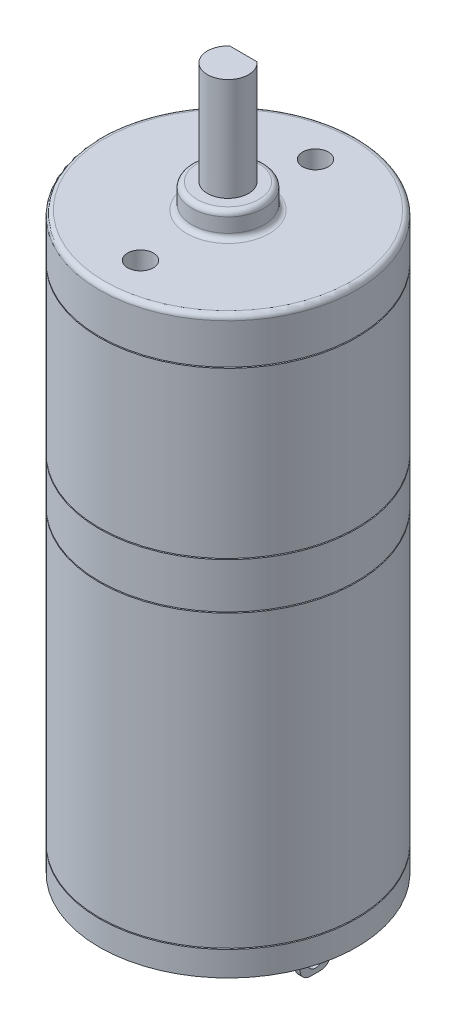
ISO-10303-21;
HEADER;
FILE_DESCRIPTION(('STEP AP214'),'2;1');
FILE_NAME('part.step','',(''),(''),'','','');
FILE_SCHEMA(('AUTOMOTIVE_DESIGN { 1 0 10303 214 1 1 1 1 }'));
ENDSEC;
DATA;
#1=APPLICATION_CONTEXT('core data for automotive mechanical design processes');
#2=APPLICATION_PROTOCOL_DEFINITION('international standard','automotive_design',2000,#1);
#3=PRODUCT_CONTEXT('',#1,'mechanical');
#4=PRODUCT('Part','Part','',(#3));
#5=PRODUCT_RELATED_PRODUCT_CATEGORY('part','',(#4));
#6=PRODUCT_DEFINITION_FORMATION('','',#4);
#7=PRODUCT_DEFINITION_CONTEXT('part definition',#1,'design');
#8=PRODUCT_DEFINITION('design','',#6,#7);
#9=PRODUCT_DEFINITION_SHAPE('','',#8);
#10=(LENGTH_UNIT() NAMED_UNIT(*) SI_UNIT(.MILLI.,.METRE.));
#11=(NAMED_UNIT(*) PLANE_ANGLE_UNIT() SI_UNIT($,.RADIAN.));
#12=(NAMED_UNIT(*) SI_UNIT($,.STERADIAN.) SOLID_ANGLE_UNIT());
#13=UNCERTAINTY_MEASURE_WITH_UNIT(LENGTH_MEASURE(1.E-05),#10,'distance_accuracy_value','');
#14=(GEOMETRIC_REPRESENTATION_CONTEXT(3) GLOBAL_UNCERTAINTY_ASSIGNED_CONTEXT((#13)) GLOBAL_UNIT_ASSIGNED_CONTEXT((#10,
#11,#12)) REPRESENTATION_CONTEXT('',''));
#15=CARTESIAN_POINT('',(0.,0.,0.));
#16=DIRECTION('',(0.,0.,1.));
#17=DIRECTION('',(1.,0.,0.));
#18=AXIS2_PLACEMENT_3D('',#15,#16,#17);
#19=CARTESIAN_POINT('',(0.,-50.6,0.));
#20=DIRECTION('',(0.,-1.,0.));
#21=DIRECTION('',(0.,0.,-1.));
#22=AXIS2_PLACEMENT_3D('',#19,#20,#21);
#23=PLANE('',#22);
#24=CARTESIAN_POINT('',(0.,-50.6,0.));
#25=DIRECTION('',(0.,-1.,0.));
#26=DIRECTION('',(0.,0.,-1.));
#27=AXIS2_PLACEMENT_3D('',#24,#25,#26);
#28=CIRCLE('',#27,11.5);
#29=CARTESIAN_POINT('',(0.,-50.6,-11.5));
#30=VERTEX_POINT('',#29);
#31=EDGE_CURVE('E243',#30,#30,#28,.T.);
#32=ORIENTED_EDGE('',*,*,#31,.T.);
#33=EDGE_LOOP('',(#32));
#34=FACE_BOUND('',#33,.T.);
#35=DIRECTION('',(0.,0.,-1.));
#36=VECTOR('',#35,1.);
#37=CARTESIAN_POINT('',(-8.5,-50.6,1.5));
#38=LINE('',#37,#36);
#39=CARTESIAN_POINT('',(-8.5,-50.6,1.5));
#40=VERTEX_POINT('',#39);
#41=CARTESIAN_POINT('',(-8.5,-50.6,-1.5));
#42=VERTEX_POINT('',#41);
#43=EDGE_CURVE('E227',#40,#42,#38,.T.);
#44=ORIENTED_EDGE('',*,*,#43,.F.);
#45=DIRECTION('',(-1.,0.,0.));
#46=VECTOR('',#45,1.);
#47=CARTESIAN_POINT('',(-8.,-50.6,1.5));
#48=LINE('',#47,#46);
#49=CARTESIAN_POINT('',(-8.,-50.6,1.5));
#50=VERTEX_POINT('',#49);
#51=EDGE_CURVE('E216',#50,#40,#48,.T.);
#52=ORIENTED_EDGE('',*,*,#51,.F.);
#53=DIRECTION('',(0.,0.,1.));
#54=VECTOR('',#53,1.);
#55=CARTESIAN_POINT('',(-8.,-50.6,-1.5));
#56=LINE('',#55,#54);
#57=CARTESIAN_POINT('',(-8.,-50.6,-1.5));
#58=VERTEX_POINT('',#57);
#59=EDGE_CURVE('E221',#58,#50,#56,.T.);
#60=ORIENTED_EDGE('',*,*,#59,.F.);
#61=DIRECTION('',(1.,0.,0.));
#62=VECTOR('',#61,1.);
#63=CARTESIAN_POINT('',(-8.5,-50.6,-1.5));
#64=LINE('',#63,#62);
#65=EDGE_CURVE('E230',#42,#58,#64,.T.);
#66=ORIENTED_EDGE('',*,*,#65,.F.);
#67=EDGE_LOOP('',(#44,#52,#60,#66));
#68=FACE_BOUND('',#67,.T.);
#69=DIRECTION('',(0.,0.,1.));
#70=VECTOR('',#69,1.);
#71=CARTESIAN_POINT('',(8.5,-50.6,1.50000000000001));
#72=LINE('',#71,#70);
#73=CARTESIAN_POINT('',(8.5,-50.6,-1.49999999999999));
#74=VERTEX_POINT('',#73);
#75=CARTESIAN_POINT('',(8.5,-50.6,1.50000000000001));
#76=VERTEX_POINT('',#75);
#77=EDGE_CURVE('E201',#74,#76,#72,.T.);
#78=ORIENTED_EDGE('',*,*,#77,.F.);
#79=DIRECTION('',(1.,0.,0.));
#80=VECTOR('',#79,1.);
#81=CARTESIAN_POINT('',(8.5,-50.6,-1.49999999999999));
#82=LINE('',#81,#80);
#83=CARTESIAN_POINT('',(8.,-50.6,-1.49999999999999));
#84=VERTEX_POINT('',#83);
#85=EDGE_CURVE('E190',#84,#74,#82,.T.);
#86=ORIENTED_EDGE('',*,*,#85,.F.);
#87=DIRECTION('',(0.,0.,-1.));
#88=VECTOR('',#87,1.);
#89=CARTESIAN_POINT('',(8.,-50.6,-1.49999999999999));
#90=LINE('',#89,#88);
#91=CARTESIAN_POINT('',(8.,-50.6,1.50000000000001));
#92=VERTEX_POINT('',#91);
#93=EDGE_CURVE('E195',#92,#84,#90,.T.);
#94=ORIENTED_EDGE('',*,*,#93,.F.);
#95=DIRECTION('',(-1.,0.,0.));
#96=VECTOR('',#95,1.);
#97=CARTESIAN_POINT('',(8.,-50.6,1.50000000000001));
#98=LINE('',#97,#96);
#99=EDGE_CURVE('E204',#76,#92,#98,.T.);
#100=ORIENTED_EDGE('',*,*,#99,.F.);
#101=EDGE_LOOP('',(#78,#86,#94,#100));
#102=FACE_BOUND('',#101,.T.);
#103=ADVANCED_FACE('F41',(#34,#68,#102),#23,.T.);
#104=CARTESIAN_POINT('',(0.,4.4,0.));
#105=DIRECTION('',(0.,-1.,0.));
#106=DIRECTION('',(0.,0.,-1.));
#107=AXIS2_PLACEMENT_3D('',#104,#105,#106);
#108=CYLINDRICAL_SURFACE('',#107,12.5);
#109=CARTESIAN_POINT('',(0.,3.9,0.));
#110=DIRECTION('',(0.,1.,0.));
#111=DIRECTION('',(0.,0.,1.));
#112=AXIS2_PLACEMENT_3D('',#109,#110,#111);
#113=CIRCLE('',#112,12.5);
#114=CARTESIAN_POINT('',(0.,3.9,12.5));
#115=VERTEX_POINT('',#114);
#116=EDGE_CURVE('E11',#115,#115,#113,.F.);
#117=ORIENTED_EDGE('',*,*,#116,.T.);
#118=EDGE_LOOP('',(#117));
#119=FACE_BOUND('',#118,.T.);
#120=CARTESIAN_POINT('',(0.,0.,0.));
#121=DIRECTION('',(0.,1.,0.));
#122=DIRECTION('',(0.,0.,1.));
#123=AXIS2_PLACEMENT_3D('',#120,#121,#122);
#124=CIRCLE('',#123,12.5);
#125=CARTESIAN_POINT('',(0.,0.,12.5));
#126=VERTEX_POINT('',#125);
#127=EDGE_CURVE('E295',#126,#126,#124,.T.);
#128=ORIENTED_EDGE('',*,*,#127,.T.);
#129=EDGE_LOOP('',(#128));
#130=FACE_BOUND('',#129,.T.);
#131=ADVANCED_FACE('F364',(#119,#130),#108,.T.);
#132=CARTESIAN_POINT('',(0.,4.4,0.));
#133=DIRECTION('',(0.,1.,0.));
#134=DIRECTION('',(0.,0.,1.));
#135=AXIS2_PLACEMENT_3D('',#132,#133,#134);
#136=PLANE('',#135);
#137=CARTESIAN_POINT('',(0.,4.4,0.));
#138=DIRECTION('',(0.,1.,0.));
#139=DIRECTION('',(0.,0.,1.));
#140=AXIS2_PLACEMENT_3D('',#137,#138,#139);
#141=CIRCLE('',#140,4.);
#142=CARTESIAN_POINT('',(0.,4.4,4.));
#143=VERTEX_POINT('',#142);
#144=EDGE_CURVE('E343',#143,#143,#141,.F.);
#145=ORIENTED_EDGE('',*,*,#144,.T.);
#146=EDGE_LOOP('',(#145));
#147=FACE_BOUND('',#146,.T.);
#148=CARTESIAN_POINT('',(0.,4.4,0.));
#149=DIRECTION('',(0.,1.,0.));
#150=DIRECTION('',(0.,0.,1.));
#151=AXIS2_PLACEMENT_3D('',#148,#149,#150);
#152=CIRCLE('',#151,12.);
#153=CARTESIAN_POINT('',(0.,4.4,12.));
#154=VERTEX_POINT('',#153);
#155=EDGE_CURVE('E340',#154,#154,#152,.T.);
#156=ORIENTED_EDGE('',*,*,#155,.T.);
#157=EDGE_LOOP('',(#156));
#158=FACE_BOUND('',#157,.T.);
#159=CARTESIAN_POINT('',(0.,4.4,-8.5));
#160=DIRECTION('',(0.,1.,0.));
#161=DIRECTION('',(0.,0.,1.));
#162=AXIS2_PLACEMENT_3D('',#159,#160,#161);
#163=CIRCLE('',#162,1.25);
#164=CARTESIAN_POINT('',(0.,4.4,-7.25));
#165=VERTEX_POINT('',#164);
#166=EDGE_CURVE('E173',#165,#165,#163,.T.);
#167=ORIENTED_EDGE('',*,*,#166,.F.);
#168=EDGE_LOOP('',(#167));
#169=FACE_BOUND('',#168,.T.);
#170=CARTESIAN_POINT('',(0.,4.4,8.5));
#171=DIRECTION('',(0.,1.,0.));
#172=DIRECTION('',(0.,0.,-1.));
#173=AXIS2_PLACEMENT_3D('',#170,#171,#172);
#174=CIRCLE('',#173,1.25);
#175=CARTESIAN_POINT('',(0.,4.4,7.25));
#176=VERTEX_POINT('',#175);
#177=EDGE_CURVE('E163',#176,#176,#174,.T.);
#178=ORIENTED_EDGE('',*,*,#177,.F.);
#179=EDGE_LOOP('',(#178));
#180=FACE_BOUND('',#179,.T.);
#181=ADVANCED_FACE('F370',(#147,#158,#169,#180),#136,.T.);
#182=CARTESIAN_POINT('',(0.,0.,0.));
#183=DIRECTION('',(0.,1.,0.));
#184=DIRECTION('',(0.,0.,1.));
#185=AXIS2_PLACEMENT_3D('',#182,#183,#184);
#186=PLANE('',#185);
#187=CARTESIAN_POINT('',(0.,0.,0.));
#188=DIRECTION('',(0.,-1.,0.));
#189=DIRECTION('',(0.,0.,-1.));
#190=AXIS2_PLACEMENT_3D('',#187,#188,#189);
#191=CIRCLE('',#190,12.15);
#192=CARTESIAN_POINT('',(0.,0.,-12.15));
#193=VERTEX_POINT('',#192);
#194=EDGE_CURVE('E286',#193,#193,#191,.T.);
#195=ORIENTED_EDGE('',*,*,#194,.F.);
#196=EDGE_LOOP('',(#195));
#197=FACE_BOUND('',#196,.T.);
#198=ORIENTED_EDGE('',*,*,#127,.F.);
#199=EDGE_LOOP('',(#198));
#200=FACE_BOUND('',#199,.T.);
#201=ADVANCED_FACE('F445',(#197,#200),#186,.F.);
#202=CARTESIAN_POINT('',(0.,-0.1,0.));
#203=DIRECTION('',(0.,1.,0.));
#204=DIRECTION('',(0.,0.,1.));
#205=AXIS2_PLACEMENT_3D('',#202,#203,#204);
#206=CYLINDRICAL_SURFACE('',#205,12.15);
#207=CARTESIAN_POINT('',(0.,-0.1,0.));
#208=DIRECTION('',(0.,-1.,0.));
#209=DIRECTION('',(0.,0.,-1.));
#210=AXIS2_PLACEMENT_3D('',#207,#208,#209);
#211=CIRCLE('',#210,12.15);
#212=CARTESIAN_POINT('',(0.,-0.1,-12.15));
#213=VERTEX_POINT('',#212);
#214=EDGE_CURVE('E290',#213,#213,#211,.T.);
#215=ORIENTED_EDGE('',*,*,#214,.F.);
#216=EDGE_LOOP('',(#215));
#217=FACE_BOUND('',#216,.T.);
#218=ORIENTED_EDGE('',*,*,#194,.T.);
#219=EDGE_LOOP('',(#218));
#220=FACE_BOUND('',#219,.T.);
#221=ADVANCED_FACE('F441',(#217,#220),#206,.T.);
#222=CARTESIAN_POINT('',(0.,-16.1,0.));
#223=DIRECTION('',(0.,1.,0.));
#224=DIRECTION('',(0.,0.,1.));
#225=AXIS2_PLACEMENT_3D('',#222,#223,#224);
#226=CYLINDRICAL_SURFACE('',#225,12.5);
#227=CARTESIAN_POINT('',(0.,-16.1,0.));
#228=DIRECTION('',(0.,-1.,0.));
#229=DIRECTION('',(0.,0.,-1.));
#230=AXIS2_PLACEMENT_3D('',#227,#228,#229);
#231=CIRCLE('',#230,12.5);
#232=CARTESIAN_POINT('',(0.,-16.1,-12.5));
#233=VERTEX_POINT('',#232);
#234=EDGE_CURVE('E287',#233,#233,#231,.T.);
#235=ORIENTED_EDGE('',*,*,#234,.F.);
#236=EDGE_LOOP('',(#235));
#237=FACE_BOUND('',#236,.T.);
#238=CARTESIAN_POINT('',(0.,-0.1,0.));
#239=DIRECTION('',(0.,-1.,0.));
#240=DIRECTION('',(0.,0.,-1.));
#241=AXIS2_PLACEMENT_3D('',#238,#239,#240);
#242=CIRCLE('',#241,12.5);
#243=CARTESIAN_POINT('',(0.,-0.1,-12.5));
#244=VERTEX_POINT('',#243);
#245=EDGE_CURVE('E283',#244,#244,#242,.T.);
#246=ORIENTED_EDGE('',*,*,#245,.T.);
#247=EDGE_LOOP('',(#246));
#248=FACE_BOUND('',#247,.T.);
#249=ADVANCED_FACE('F434',(#237,#248),#226,.T.);
#250=CARTESIAN_POINT('',(0.,-16.1,0.));
#251=DIRECTION('',(0.,-1.,0.));
#252=DIRECTION('',(0.,0.,-1.));
#253=AXIS2_PLACEMENT_3D('',#250,#251,#252);
#254=PLANE('',#253);
#255=CARTESIAN_POINT('',(0.,-16.1,0.));
#256=DIRECTION('',(0.,-1.,0.));
#257=DIRECTION('',(0.,0.,-1.));
#258=AXIS2_PLACEMENT_3D('',#255,#256,#257);
#259=CIRCLE('',#258,12.15);
#260=CARTESIAN_POINT('',(0.,-16.1,-12.15));
#261=VERTEX_POINT('',#260);
#262=EDGE_CURVE('E274',#261,#261,#259,.T.);
#263=ORIENTED_EDGE('',*,*,#262,.F.);
#264=EDGE_LOOP('',(#263));
#265=FACE_BOUND('',#264,.T.);
#266=ORIENTED_EDGE('',*,*,#234,.T.);
#267=EDGE_LOOP('',(#266));
#268=FACE_BOUND('',#267,.T.);
#269=ADVANCED_FACE('F431',(#265,#268),#254,.T.);
#270=CARTESIAN_POINT('',(0.,-0.1,0.));
#271=DIRECTION('',(0.,-1.,0.));
#272=DIRECTION('',(0.,0.,-1.));
#273=AXIS2_PLACEMENT_3D('',#270,#271,#272);
#274=PLANE('',#273);
#275=ORIENTED_EDGE('',*,*,#214,.T.);
#276=EDGE_LOOP('',(#275));
#277=FACE_BOUND('',#276,.T.);
#278=ORIENTED_EDGE('',*,*,#245,.F.);
#279=EDGE_LOOP('',(#278));
#280=FACE_BOUND('',#279,.T.);
#281=ADVANCED_FACE('F429',(#277,#280),#274,.F.);
#282=CARTESIAN_POINT('',(0.,-16.2,0.));
#283=DIRECTION('',(0.,1.,0.));
#284=DIRECTION('',(0.,0.,1.));
#285=AXIS2_PLACEMENT_3D('',#282,#283,#284);
#286=CYLINDRICAL_SURFACE('',#285,12.15);
#287=CARTESIAN_POINT('',(0.,-16.2,0.));
#288=DIRECTION('',(0.,-1.,0.));
#289=DIRECTION('',(0.,0.,-1.));
#290=AXIS2_PLACEMENT_3D('',#287,#288,#289);
#291=CIRCLE('',#290,12.15);
#292=CARTESIAN_POINT('',(0.,-16.2,-12.15));
#293=VERTEX_POINT('',#292);
#294=EDGE_CURVE('E278',#293,#293,#291,.T.);
#295=ORIENTED_EDGE('',*,*,#294,.F.);
#296=EDGE_LOOP('',(#295));
#297=FACE_BOUND('',#296,.T.);
#298=ORIENTED_EDGE('',*,*,#262,.T.);
#299=EDGE_LOOP('',(#298));
#300=FACE_BOUND('',#299,.T.);
#301=ADVANCED_FACE('F425',(#297,#300),#286,.T.);
#302=CARTESIAN_POINT('',(0.,-20.6,0.));
#303=DIRECTION('',(0.,1.,0.));
#304=DIRECTION('',(0.,0.,1.));
#305=AXIS2_PLACEMENT_3D('',#302,#303,#304);
#306=CYLINDRICAL_SURFACE('',#305,12.5);
#307=CARTESIAN_POINT('',(0.,-20.6,0.));
#308=DIRECTION('',(0.,-1.,0.));
#309=DIRECTION('',(0.,0.,-1.));
#310=AXIS2_PLACEMENT_3D('',#307,#308,#309);
#311=CIRCLE('',#310,12.5);
#312=CARTESIAN_POINT('',(0.,-20.6,-12.5));
#313=VERTEX_POINT('',#312);
#314=EDGE_CURVE('E275',#313,#313,#311,.T.);
#315=ORIENTED_EDGE('',*,*,#314,.F.);
#316=EDGE_LOOP('',(#315));
#317=FACE_BOUND('',#316,.T.);
#318=CARTESIAN_POINT('',(0.,-16.2,0.));
#319=DIRECTION('',(0.,-1.,0.));
#320=DIRECTION('',(0.,0.,-1.));
#321=AXIS2_PLACEMENT_3D('',#318,#319,#320);
#322=CIRCLE('',#321,12.5);
#323=CARTESIAN_POINT('',(0.,-16.2,-12.5));
#324=VERTEX_POINT('',#323);
#325=EDGE_CURVE('E271',#324,#324,#322,.T.);
#326=ORIENTED_EDGE('',*,*,#325,.T.);
#327=EDGE_LOOP('',(#326));
#328=FACE_BOUND('',#327,.T.);
#329=ADVANCED_FACE('F418',(#317,#328),#306,.T.);
#330=CARTESIAN_POINT('',(0.,-20.6,0.));
#331=DIRECTION('',(0.,-1.,0.));
#332=DIRECTION('',(0.,0.,-1.));
#333=AXIS2_PLACEMENT_3D('',#330,#331,#332);
#334=PLANE('',#333);
#335=CARTESIAN_POINT('',(0.,-20.6,0.));
#336=DIRECTION('',(0.,-1.,0.));
#337=DIRECTION('',(0.,0.,-1.));
#338=AXIS2_PLACEMENT_3D('',#335,#336,#337);
#339=CIRCLE('',#338,12.15);
#340=CARTESIAN_POINT('',(0.,-20.6,-12.15));
#341=VERTEX_POINT('',#340);
#342=EDGE_CURVE('E262',#341,#341,#339,.T.);
#343=ORIENTED_EDGE('',*,*,#342,.F.);
#344=EDGE_LOOP('',(#343));
#345=FACE_BOUND('',#344,.T.);
#346=ORIENTED_EDGE('',*,*,#314,.T.);
#347=EDGE_LOOP('',(#346));
#348=FACE_BOUND('',#347,.T.);
#349=ADVANCED_FACE('F415',(#345,#348),#334,.T.);
#350=CARTESIAN_POINT('',(0.,-16.2,0.));
#351=DIRECTION('',(0.,-1.,0.));
#352=DIRECTION('',(0.,0.,-1.));
#353=AXIS2_PLACEMENT_3D('',#350,#351,#352);
#354=PLANE('',#353);
#355=ORIENTED_EDGE('',*,*,#294,.T.);
#356=EDGE_LOOP('',(#355));
#357=FACE_BOUND('',#356,.T.);
#358=ORIENTED_EDGE('',*,*,#325,.F.);
#359=EDGE_LOOP('',(#358));
#360=FACE_BOUND('',#359,.T.);
#361=ADVANCED_FACE('F413',(#357,#360),#354,.F.);
#362=CARTESIAN_POINT('',(0.,-20.7,0.));
#363=DIRECTION('',(0.,1.,0.));
#364=DIRECTION('',(0.,0.,1.));
#365=AXIS2_PLACEMENT_3D('',#362,#363,#364);
#366=CYLINDRICAL_SURFACE('',#365,12.15);
#367=CARTESIAN_POINT('',(0.,-20.7,0.));
#368=DIRECTION('',(0.,-1.,0.));
#369=DIRECTION('',(0.,0.,-1.));
#370=AXIS2_PLACEMENT_3D('',#367,#368,#369);
#371=CIRCLE('',#370,12.15);
#372=CARTESIAN_POINT('',(0.,-20.7,-12.15));
#373=VERTEX_POINT('',#372);
#374=EDGE_CURVE('E266',#373,#373,#371,.T.);
#375=ORIENTED_EDGE('',*,*,#374,.F.);
#376=EDGE_LOOP('',(#375));
#377=FACE_BOUND('',#376,.T.);
#378=ORIENTED_EDGE('',*,*,#342,.T.);
#379=EDGE_LOOP('',(#378));
#380=FACE_BOUND('',#379,.T.);
#381=ADVANCED_FACE('F409',(#377,#380),#366,.T.);
#382=CARTESIAN_POINT('',(0.,-48.9,0.));
#383=DIRECTION('',(0.,1.,0.));
#384=DIRECTION('',(0.,0.,1.));
#385=AXIS2_PLACEMENT_3D('',#382,#383,#384);
#386=CYLINDRICAL_SURFACE('',#385,12.5);
#387=CARTESIAN_POINT('',(0.,-48.9,0.));
#388=DIRECTION('',(0.,-1.,0.));
#389=DIRECTION('',(0.,0.,-1.));
#390=AXIS2_PLACEMENT_3D('',#387,#388,#389);
#391=CIRCLE('',#390,12.5);
#392=CARTESIAN_POINT('',(0.,-48.9,-12.5));
#393=VERTEX_POINT('',#392);
#394=EDGE_CURVE('E263',#393,#393,#391,.T.);
#395=ORIENTED_EDGE('',*,*,#394,.F.);
#396=EDGE_LOOP('',(#395));
#397=FACE_BOUND('',#396,.T.);
#398=CARTESIAN_POINT('',(0.,-20.7,0.));
#399=DIRECTION('',(0.,-1.,0.));
#400=DIRECTION('',(0.,0.,-1.));
#401=AXIS2_PLACEMENT_3D('',#398,#399,#400);
#402=CIRCLE('',#401,12.5);
#403=CARTESIAN_POINT('',(0.,-20.7,-12.5));
#404=VERTEX_POINT('',#403);
#405=EDGE_CURVE('E257',#404,#404,#402,.T.);
#406=ORIENTED_EDGE('',*,*,#405,.T.);
#407=EDGE_LOOP('',(#406));
#408=FACE_BOUND('',#407,.T.);
#409=ADVANCED_FACE('F402',(#397,#408),#386,.T.);
#410=CARTESIAN_POINT('',(0.,-48.9,0.));
#411=DIRECTION('',(0.,-1.,0.));
#412=DIRECTION('',(0.,0.,-1.));
#413=AXIS2_PLACEMENT_3D('',#410,#411,#412);
#414=PLANE('',#413);
#415=CARTESIAN_POINT('',(0.,-48.9,0.));
#416=DIRECTION('',(0.,-1.,0.));
#417=DIRECTION('',(0.,0.,-1.));
#418=AXIS2_PLACEMENT_3D('',#415,#416,#417);
#419=CIRCLE('',#418,12.15);
#420=CARTESIAN_POINT('',(0.,-48.9,-12.15));
#421=VERTEX_POINT('',#420);
#422=EDGE_CURVE('E258',#421,#421,#419,.T.);
#423=ORIENTED_EDGE('',*,*,#422,.F.);
#424=EDGE_LOOP('',(#423));
#425=FACE_BOUND('',#424,.T.);
#426=ORIENTED_EDGE('',*,*,#394,.T.);
#427=EDGE_LOOP('',(#426));
#428=FACE_BOUND('',#427,.T.);
#429=ADVANCED_FACE('F399',(#425,#428),#414,.T.);
#430=CARTESIAN_POINT('',(0.,-20.7,0.));
#431=DIRECTION('',(0.,-1.,0.));
#432=DIRECTION('',(0.,0.,-1.));
#433=AXIS2_PLACEMENT_3D('',#430,#431,#432);
#434=PLANE('',#433);
#435=ORIENTED_EDGE('',*,*,#374,.T.);
#436=EDGE_LOOP('',(#435));
#437=FACE_BOUND('',#436,.T.);
#438=ORIENTED_EDGE('',*,*,#405,.F.);
#439=EDGE_LOOP('',(#438));
#440=FACE_BOUND('',#439,.T.);
#441=ADVANCED_FACE('F397',(#437,#440),#434,.F.);
#442=CARTESIAN_POINT('',(0.,-49.,0.));
#443=DIRECTION('',(0.,1.,0.));
#444=DIRECTION('',(0.,0.,1.));
#445=AXIS2_PLACEMENT_3D('',#442,#443,#444);
#446=CYLINDRICAL_SURFACE('',#445,12.15);
#447=CARTESIAN_POINT('',(0.,-49.,0.));
#448=DIRECTION('',(0.,-1.,0.));
#449=DIRECTION('',(0.,0.,-1.));
#450=AXIS2_PLACEMENT_3D('',#447,#448,#449);
#451=CIRCLE('',#450,12.15);
#452=CARTESIAN_POINT('',(0.,-49.,-12.15));
#453=VERTEX_POINT('',#452);
#454=EDGE_CURVE('E252',#453,#453,#451,.T.);
#455=ORIENTED_EDGE('',*,*,#454,.F.);
#456=EDGE_LOOP('',(#455));
#457=FACE_BOUND('',#456,.T.);
#458=ORIENTED_EDGE('',*,*,#422,.T.);
#459=EDGE_LOOP('',(#458));
#460=FACE_BOUND('',#459,.T.);
#461=ADVANCED_FACE('F393',(#457,#460),#446,.T.);
#462=CARTESIAN_POINT('',(0.,-51.4,0.));
#463=DIRECTION('',(0.,1.,0.));
#464=DIRECTION('',(0.,0.,1.));
#465=AXIS2_PLACEMENT_3D('',#462,#463,#464);
#466=CYLINDRICAL_SURFACE('',#465,12.5);
#467=CARTESIAN_POINT('',(0.,-51.4,0.));
#468=DIRECTION('',(0.,-1.,0.));
#469=DIRECTION('',(0.,0.,-1.));
#470=AXIS2_PLACEMENT_3D('',#467,#468,#469);
#471=CIRCLE('',#470,12.5);
#472=CARTESIAN_POINT('',(0.,-51.4,-12.5));
#473=VERTEX_POINT('',#472);
#474=EDGE_CURVE('E249',#473,#473,#471,.T.);
#475=ORIENTED_EDGE('',*,*,#474,.F.);
#476=EDGE_LOOP('',(#475));
#477=FACE_BOUND('',#476,.T.);
#478=CARTESIAN_POINT('',(0.,-49.,0.));
#479=DIRECTION('',(0.,-1.,0.));
#480=DIRECTION('',(0.,0.,-1.));
#481=AXIS2_PLACEMENT_3D('',#478,#479,#480);
#482=CIRCLE('',#481,12.5);
#483=CARTESIAN_POINT('',(0.,-49.,-12.5));
#484=VERTEX_POINT('',#483);
#485=EDGE_CURVE('E246',#484,#484,#482,.T.);
#486=ORIENTED_EDGE('',*,*,#485,.T.);
#487=EDGE_LOOP('',(#486));
#488=FACE_BOUND('',#487,.T.);
#489=ADVANCED_FACE('F386',(#477,#488),#466,.T.);
#490=CARTESIAN_POINT('',(0.,-51.4,0.));
#491=DIRECTION('',(0.,-1.,0.));
#492=DIRECTION('',(0.,0.,-1.));
#493=AXIS2_PLACEMENT_3D('',#490,#491,#492);
#494=PLANE('',#493);
#495=CARTESIAN_POINT('',(0.,-51.4,0.));
#496=DIRECTION('',(0.,-1.,0.));
#497=DIRECTION('',(0.,0.,-1.));
#498=AXIS2_PLACEMENT_3D('',#495,#496,#497);
#499=CIRCLE('',#498,11.5);
#500=CARTESIAN_POINT('',(0.,-51.4,-11.5));
#501=VERTEX_POINT('',#500);
#502=EDGE_CURVE('E242',#501,#501,#499,.T.);
#503=ORIENTED_EDGE('',*,*,#502,.F.);
#504=EDGE_LOOP('',(#503));
#505=FACE_BOUND('',#504,.T.);
#506=ORIENTED_EDGE('',*,*,#474,.T.);
#507=EDGE_LOOP('',(#506));
#508=FACE_BOUND('',#507,.T.);
#509=ADVANCED_FACE('F383',(#505,#508),#494,.T.);
#510=CARTESIAN_POINT('',(0.,-49.,0.));
#511=DIRECTION('',(0.,-1.,0.));
#512=DIRECTION('',(0.,0.,-1.));
#513=AXIS2_PLACEMENT_3D('',#510,#511,#512);
#514=PLANE('',#513);
#515=ORIENTED_EDGE('',*,*,#454,.T.);
#516=EDGE_LOOP('',(#515));
#517=FACE_BOUND('',#516,.T.);
#518=ORIENTED_EDGE('',*,*,#485,.F.);
#519=EDGE_LOOP('',(#518));
#520=FACE_BOUND('',#519,.T.);
#521=ADVANCED_FACE('F381',(#517,#520),#514,.F.);
#522=CARTESIAN_POINT('',(0.,-50.6,0.));
#523=DIRECTION('',(0.,-1.,0.));
#524=DIRECTION('',(0.,0.,-1.));
#525=AXIS2_PLACEMENT_3D('',#522,#523,#524);
#526=CYLINDRICAL_SURFACE('',#525,11.5);
#527=ORIENTED_EDGE('',*,*,#31,.F.);
#528=EDGE_LOOP('',(#527));
#529=FACE_BOUND('',#528,.T.);
#530=ORIENTED_EDGE('',*,*,#502,.T.);
#531=EDGE_LOOP('',(#530));
#532=FACE_BOUND('',#531,.T.);
#533=ADVANCED_FACE('F378',(#529,#532),#526,.F.);
#534=CARTESIAN_POINT('',(-8.,-55.6,1.5));
#535=DIRECTION('',(0.,0.,-1.));
#536=DIRECTION('',(-1.,0.,0.));
#537=AXIS2_PLACEMENT_3D('',#534,#535,#536);
#538=PLANE('',#537);
#539=DIRECTION('',(0.,1.,0.));
#540=VECTOR('',#539,1.);
#541=CARTESIAN_POINT('',(-8.5,-55.6,1.5));
#542=LINE('',#541,#540);
#543=CARTESIAN_POINT('',(-8.5,-54.6,1.5));
#544=VERTEX_POINT('',#543);
#545=EDGE_CURVE('E240',#544,#40,#542,.T.);
#546=ORIENTED_EDGE('',*,*,#545,.F.);
#547=DIRECTION('',(-1.,0.,0.));
#548=VECTOR('',#547,1.);
#549=CARTESIAN_POINT('',(-8.,-54.6,1.5));
#550=LINE('',#549,#548);
#551=CARTESIAN_POINT('',(-8.,-54.6,1.5));
#552=VERTEX_POINT('',#551);
#553=EDGE_CURVE('E311',#544,#552,#550,.F.);
#554=ORIENTED_EDGE('',*,*,#553,.T.);
#555=DIRECTION('',(0.,1.,0.));
#556=VECTOR('',#555,1.);
#557=CARTESIAN_POINT('',(-8.,-55.6,1.5));
#558=LINE('',#557,#556);
#559=EDGE_CURVE('E224',#552,#50,#558,.T.);
#560=ORIENTED_EDGE('',*,*,#559,.T.);
#561=ORIENTED_EDGE('',*,*,#51,.T.);
#562=EDGE_LOOP('',(#546,#554,#560,#561));
#563=FACE_BOUND('',#562,.T.);
#564=ADVANCED_FACE('F376',(#563),#538,.F.);
#565=CARTESIAN_POINT('',(-8.5,-55.6,1.5));
#566=DIRECTION('',(1.,0.,0.));
#567=DIRECTION('',(0.,0.,-1.));
#568=AXIS2_PLACEMENT_3D('',#565,#566,#567);
#569=PLANE('',#568);
#570=CARTESIAN_POINT('',(-8.5,-54.4,0.));
#571=DIRECTION('',(1.,0.,0.));
#572=DIRECTION('',(0.,0.,-1.));
#573=AXIS2_PLACEMENT_3D('',#570,#571,#572);
#574=CIRCLE('',#573,0.750000000000001);
#575=CARTESIAN_POINT('',(-8.5,-54.4,-0.750000000000009));
#576=VERTEX_POINT('',#575);
#577=EDGE_CURVE('E187',#576,#576,#574,.T.);
#578=ORIENTED_EDGE('',*,*,#577,.T.);
#579=EDGE_LOOP('',(#578));
#580=FACE_BOUND('',#579,.T.);
#581=DIRECTION('',(0.,0.,-1.));
#582=VECTOR('',#581,1.);
#583=CARTESIAN_POINT('',(-8.5,-55.6,1.5));
#584=LINE('',#583,#582);
#585=CARTESIAN_POINT('',(-8.5,-55.6,0.5));
#586=VERTEX_POINT('',#585);
#587=CARTESIAN_POINT('',(-8.5,-55.6,-0.5));
#588=VERTEX_POINT('',#587);
#589=EDGE_CURVE('E217',#586,#588,#584,.T.);
#590=ORIENTED_EDGE('',*,*,#589,.F.);
#591=CARTESIAN_POINT('',(-8.5,-54.6,0.5));
#592=DIRECTION('',(1.,0.,0.));
#593=DIRECTION('',(0.,0.,-1.));
#594=AXIS2_PLACEMENT_3D('',#591,#592,#593);
#595=CIRCLE('',#594,1.);
#596=EDGE_CURVE('E309',#586,#544,#595,.F.);
#597=ORIENTED_EDGE('',*,*,#596,.T.);
#598=ORIENTED_EDGE('',*,*,#545,.T.);
#599=ORIENTED_EDGE('',*,*,#43,.T.);
#600=DIRECTION('',(0.,1.,0.));
#601=VECTOR('',#600,1.);
#602=CARTESIAN_POINT('',(-8.5,-55.6,-1.5));
#603=LINE('',#602,#601);
#604=CARTESIAN_POINT('',(-8.5,-54.6,-1.5));
#605=VERTEX_POINT('',#604);
#606=EDGE_CURVE('E238',#605,#42,#603,.T.);
#607=ORIENTED_EDGE('',*,*,#606,.F.);
#608=CARTESIAN_POINT('',(-8.5,-54.6,-0.5));
#609=DIRECTION('',(1.,0.,0.));
#610=DIRECTION('',(0.,0.,-1.));
#611=AXIS2_PLACEMENT_3D('',#608,#609,#610);
#612=CIRCLE('',#611,1.);
#613=EDGE_CURVE('E307',#605,#588,#612,.F.);
#614=ORIENTED_EDGE('',*,*,#613,.T.);
#615=EDGE_LOOP('',(#590,#597,#598,#599,#607,#614));
#616=FACE_BOUND('',#615,.T.);
#617=ADVANCED_FACE('F527',(#580,#616),#569,.F.);
#618=CARTESIAN_POINT('',(-8.5,-55.6,-1.5));
#619=DIRECTION('',(0.,0.,1.));
#620=DIRECTION('',(1.,0.,0.));
#621=AXIS2_PLACEMENT_3D('',#618,#619,#620);
#622=PLANE('',#621);
#623=DIRECTION('',(0.,1.,0.));
#624=VECTOR('',#623,1.);
#625=CARTESIAN_POINT('',(-8.,-55.6,-1.5));
#626=LINE('',#625,#624);
#627=CARTESIAN_POINT('',(-8.,-54.6,-1.5));
#628=VERTEX_POINT('',#627);
#629=EDGE_CURVE('E236',#628,#58,#626,.T.);
#630=ORIENTED_EDGE('',*,*,#629,.F.);
#631=DIRECTION('',(1.,0.,0.));
#632=VECTOR('',#631,1.);
#633=CARTESIAN_POINT('',(-8.5,-54.6,-1.5));
#634=LINE('',#633,#632);
#635=EDGE_CURVE('E317',#628,#605,#634,.F.);
#636=ORIENTED_EDGE('',*,*,#635,.T.);
#637=ORIENTED_EDGE('',*,*,#606,.T.);
#638=ORIENTED_EDGE('',*,*,#65,.T.);
#639=EDGE_LOOP('',(#630,#636,#637,#638));
#640=FACE_BOUND('',#639,.T.);
#641=ADVANCED_FACE('F524',(#640),#622,.F.);
#642=CARTESIAN_POINT('',(-8.,-55.6,-1.5));
#643=DIRECTION('',(-1.,0.,0.));
#644=DIRECTION('',(0.,0.,1.));
#645=AXIS2_PLACEMENT_3D('',#642,#643,#644);
#646=PLANE('',#645);
#647=CARTESIAN_POINT('',(-8.,-54.4,0.));
#648=DIRECTION('',(-1.,0.,0.));
#649=DIRECTION('',(0.,0.,1.));
#650=AXIS2_PLACEMENT_3D('',#647,#648,#649);
#651=CIRCLE('',#650,0.750000000000001);
#652=CARTESIAN_POINT('',(-8.,-54.4,0.749999999999993));
#653=VERTEX_POINT('',#652);
#654=EDGE_CURVE('E184',#653,#653,#651,.T.);
#655=ORIENTED_EDGE('',*,*,#654,.T.);
#656=EDGE_LOOP('',(#655));
#657=FACE_BOUND('',#656,.T.);
#658=ORIENTED_EDGE('',*,*,#559,.F.);
#659=CARTESIAN_POINT('',(-8.,-54.6,0.5));
#660=DIRECTION('',(-1.,0.,0.));
#661=DIRECTION('',(0.,0.,1.));
#662=AXIS2_PLACEMENT_3D('',#659,#660,#661);
#663=CIRCLE('',#662,1.);
#664=CARTESIAN_POINT('',(-8.,-55.6,0.5));
#665=VERTEX_POINT('',#664);
#666=EDGE_CURVE('E315',#552,#665,#663,.F.);
#667=ORIENTED_EDGE('',*,*,#666,.T.);
#668=DIRECTION('',(0.,0.,1.));
#669=VECTOR('',#668,1.);
#670=CARTESIAN_POINT('',(-8.,-55.6,-1.5));
#671=LINE('',#670,#669);
#672=CARTESIAN_POINT('',(-8.,-55.6,-0.5));
#673=VERTEX_POINT('',#672);
#674=EDGE_CURVE('E220',#673,#665,#671,.T.);
#675=ORIENTED_EDGE('',*,*,#674,.F.);
#676=CARTESIAN_POINT('',(-8.,-54.6,-0.5));
#677=DIRECTION('',(-1.,0.,0.));
#678=DIRECTION('',(0.,0.,1.));
#679=AXIS2_PLACEMENT_3D('',#676,#677,#678);
#680=CIRCLE('',#679,1.);
#681=EDGE_CURVE('E313',#673,#628,#680,.F.);
#682=ORIENTED_EDGE('',*,*,#681,.T.);
#683=ORIENTED_EDGE('',*,*,#629,.T.);
#684=ORIENTED_EDGE('',*,*,#59,.T.);
#685=EDGE_LOOP('',(#658,#667,#675,#682,#683,#684));
#686=FACE_BOUND('',#685,.T.);
#687=ADVANCED_FACE('F520',(#657,#686),#646,.F.);
#688=CARTESIAN_POINT('',(0.,-55.6,0.));
#689=DIRECTION('',(0.,-1.,0.));
#690=DIRECTION('',(0.,0.,-1.));
#691=AXIS2_PLACEMENT_3D('',#688,#689,#690);
#692=PLANE('',#691);
#693=ORIENTED_EDGE('',*,*,#674,.T.);
#694=DIRECTION('',(-1.,0.,0.));
#695=VECTOR('',#694,1.);
#696=CARTESIAN_POINT('',(-8.5,-55.6,0.5));
#697=LINE('',#696,#695);
#698=EDGE_CURVE('E304',#665,#586,#697,.T.);
#699=ORIENTED_EDGE('',*,*,#698,.T.);
#700=ORIENTED_EDGE('',*,*,#589,.T.);
#701=DIRECTION('',(1.,0.,0.));
#702=VECTOR('',#701,1.);
#703=CARTESIAN_POINT('',(-8.,-55.6,-0.5));
#704=LINE('',#703,#702);
#705=EDGE_CURVE('E261',#588,#673,#704,.T.);
#706=ORIENTED_EDGE('',*,*,#705,.T.);
#707=EDGE_LOOP('',(#693,#699,#700,#706));
#708=FACE_BOUND('',#707,.T.);
#709=ADVANCED_FACE('F517',(#708),#692,.T.);
#710=CARTESIAN_POINT('',(8.5,-55.6,-1.49999999999999));
#711=DIRECTION('',(0.,0.,1.));
#712=DIRECTION('',(1.,0.,0.));
#713=AXIS2_PLACEMENT_3D('',#710,#711,#712);
#714=PLANE('',#713);
#715=DIRECTION('',(0.,1.,0.));
#716=VECTOR('',#715,1.);
#717=CARTESIAN_POINT('',(8.5,-55.6,-1.49999999999999));
#718=LINE('',#717,#716);
#719=CARTESIAN_POINT('',(8.5,-54.6,-1.49999999999999));
#720=VERTEX_POINT('',#719);
#721=EDGE_CURVE('E214',#720,#74,#718,.T.);
#722=ORIENTED_EDGE('',*,*,#721,.F.);
#723=DIRECTION('',(1.,0.,0.));
#724=VECTOR('',#723,1.);
#725=CARTESIAN_POINT('',(8.5,-54.6,-1.49999999999999));
#726=LINE('',#725,#724);
#727=CARTESIAN_POINT('',(8.,-54.6,-1.49999999999999));
#728=VERTEX_POINT('',#727);
#729=EDGE_CURVE('E329',#720,#728,#726,.F.);
#730=ORIENTED_EDGE('',*,*,#729,.T.);
#731=DIRECTION('',(0.,1.,0.));
#732=VECTOR('',#731,1.);
#733=CARTESIAN_POINT('',(8.,-55.6,-1.49999999999999));
#734=LINE('',#733,#732);
#735=EDGE_CURVE('E198',#728,#84,#734,.T.);
#736=ORIENTED_EDGE('',*,*,#735,.T.);
#737=ORIENTED_EDGE('',*,*,#85,.T.);
#738=EDGE_LOOP('',(#722,#730,#736,#737));
#739=FACE_BOUND('',#738,.T.);
#740=ADVANCED_FACE('F490',(#739),#714,.F.);
#741=CARTESIAN_POINT('',(8.5,-55.6,1.50000000000001));
#742=DIRECTION('',(-1.,0.,0.));
#743=DIRECTION('',(0.,0.,1.));
#744=AXIS2_PLACEMENT_3D('',#741,#742,#743);
#745=PLANE('',#744);
#746=CARTESIAN_POINT('',(8.5,-54.4,0.));
#747=DIRECTION('',(1.,0.,0.));
#748=DIRECTION('',(0.,0.,-1.));
#749=AXIS2_PLACEMENT_3D('',#746,#747,#748);
#750=CIRCLE('',#749,0.750000000000001);
#751=CARTESIAN_POINT('',(8.5,-54.4,-0.750000000000009));
#752=VERTEX_POINT('',#751);
#753=EDGE_CURVE('E172',#752,#752,#750,.T.);
#754=ORIENTED_EDGE('',*,*,#753,.F.);
#755=EDGE_LOOP('',(#754));
#756=FACE_BOUND('',#755,.T.);
#757=DIRECTION('',(0.,0.,1.));
#758=VECTOR('',#757,1.);
#759=CARTESIAN_POINT('',(8.5,-55.6,1.50000000000001));
#760=LINE('',#759,#758);
#761=CARTESIAN_POINT('',(8.5,-55.6,-0.499999999999993));
#762=VERTEX_POINT('',#761);
#763=CARTESIAN_POINT('',(8.5,-55.6,0.500000000000007));
#764=VERTEX_POINT('',#763);
#765=EDGE_CURVE('E191',#762,#764,#760,.T.);
#766=ORIENTED_EDGE('',*,*,#765,.F.);
#767=CARTESIAN_POINT('',(8.5,-54.6,-0.499999999999993));
#768=DIRECTION('',(-1.,0.,0.));
#769=DIRECTION('',(0.,0.,1.));
#770=AXIS2_PLACEMENT_3D('',#767,#768,#769);
#771=CIRCLE('',#770,1.);
#772=EDGE_CURVE('E327',#762,#720,#771,.F.);
#773=ORIENTED_EDGE('',*,*,#772,.T.);
#774=ORIENTED_EDGE('',*,*,#721,.T.);
#775=ORIENTED_EDGE('',*,*,#77,.T.);
#776=DIRECTION('',(0.,1.,0.));
#777=VECTOR('',#776,1.);
#778=CARTESIAN_POINT('',(8.5,-55.6,1.50000000000001));
#779=LINE('',#778,#777);
#780=CARTESIAN_POINT('',(8.5,-54.6,1.50000000000001));
#781=VERTEX_POINT('',#780);
#782=EDGE_CURVE('E212',#781,#76,#779,.T.);
#783=ORIENTED_EDGE('',*,*,#782,.F.);
#784=CARTESIAN_POINT('',(8.5,-54.6,0.500000000000007));
#785=DIRECTION('',(-1.,0.,0.));
#786=DIRECTION('',(0.,0.,1.));
#787=AXIS2_PLACEMENT_3D('',#784,#785,#786);
#788=CIRCLE('',#787,1.);
#789=EDGE_CURVE('E325',#781,#764,#788,.F.);
#790=ORIENTED_EDGE('',*,*,#789,.T.);
#791=EDGE_LOOP('',(#766,#773,#774,#775,#783,#790));
#792=FACE_BOUND('',#791,.T.);
#793=ADVANCED_FACE('F482',(#756,#792),#745,.F.);
#794=CARTESIAN_POINT('',(8.,-55.6,1.50000000000001));
#795=DIRECTION('',(0.,0.,-1.));
#796=DIRECTION('',(-1.,0.,0.));
#797=AXIS2_PLACEMENT_3D('',#794,#795,#796);
#798=PLANE('',#797);
#799=DIRECTION('',(0.,1.,0.));
#800=VECTOR('',#799,1.);
#801=CARTESIAN_POINT('',(8.,-55.6,1.50000000000001));
#802=LINE('',#801,#800);
#803=CARTESIAN_POINT('',(8.,-54.6,1.50000000000001));
#804=VERTEX_POINT('',#803);
#805=EDGE_CURVE('E210',#804,#92,#802,.T.);
#806=ORIENTED_EDGE('',*,*,#805,.F.);
#807=DIRECTION('',(-1.,0.,0.));
#808=VECTOR('',#807,1.);
#809=CARTESIAN_POINT('',(8.,-54.6,1.50000000000001));
#810=LINE('',#809,#808);
#811=EDGE_CURVE('E168',#804,#781,#810,.F.);
#812=ORIENTED_EDGE('',*,*,#811,.T.);
#813=ORIENTED_EDGE('',*,*,#782,.T.);
#814=ORIENTED_EDGE('',*,*,#99,.T.);
#815=EDGE_LOOP('',(#806,#812,#813,#814));
#816=FACE_BOUND('',#815,.T.);
#817=ADVANCED_FACE('F498',(#816),#798,.F.);
#818=CARTESIAN_POINT('',(8.,-55.6,-1.49999999999999));
#819=DIRECTION('',(1.,0.,0.));
#820=DIRECTION('',(0.,0.,-1.));
#821=AXIS2_PLACEMENT_3D('',#818,#819,#820);
#822=PLANE('',#821);
#823=CARTESIAN_POINT('',(8.,-54.4,0.));
#824=DIRECTION('',(1.,0.,0.));
#825=DIRECTION('',(0.,0.,-1.));
#826=AXIS2_PLACEMENT_3D('',#823,#824,#825);
#827=CIRCLE('',#826,0.750000000000001);
#828=CARTESIAN_POINT('',(8.,-54.4,-0.750000000000009));
#829=VERTEX_POINT('',#828);
#830=EDGE_CURVE('E183',#829,#829,#827,.T.);
#831=ORIENTED_EDGE('',*,*,#830,.T.);
#832=EDGE_LOOP('',(#831));
#833=FACE_BOUND('',#832,.T.);
#834=ORIENTED_EDGE('',*,*,#735,.F.);
#835=CARTESIAN_POINT('',(8.,-54.6,-0.499999999999993));
#836=DIRECTION('',(1.,0.,0.));
#837=DIRECTION('',(0.,0.,-1.));
#838=AXIS2_PLACEMENT_3D('',#835,#836,#837);
#839=CIRCLE('',#838,1.);
#840=CARTESIAN_POINT('',(8.,-55.6,-0.499999999999993));
#841=VERTEX_POINT('',#840);
#842=EDGE_CURVE('E332',#728,#841,#839,.F.);
#843=ORIENTED_EDGE('',*,*,#842,.T.);
#844=DIRECTION('',(0.,0.,-1.));
#845=VECTOR('',#844,1.);
#846=CARTESIAN_POINT('',(8.,-55.6,-1.49999999999999));
#847=LINE('',#846,#845);
#848=CARTESIAN_POINT('',(8.,-55.6,0.500000000000007));
#849=VERTEX_POINT('',#848);
#850=EDGE_CURVE('E194',#849,#841,#847,.T.);
#851=ORIENTED_EDGE('',*,*,#850,.F.);
#852=CARTESIAN_POINT('',(8.,-54.6,0.500000000000007));
#853=DIRECTION('',(1.,0.,0.));
#854=DIRECTION('',(0.,0.,-1.));
#855=AXIS2_PLACEMENT_3D('',#852,#853,#854);
#856=CIRCLE('',#855,1.);
#857=EDGE_CURVE('E64',#849,#804,#856,.F.);
#858=ORIENTED_EDGE('',*,*,#857,.T.);
#859=ORIENTED_EDGE('',*,*,#805,.T.);
#860=ORIENTED_EDGE('',*,*,#93,.T.);
#861=EDGE_LOOP('',(#834,#843,#851,#858,#859,#860));
#862=FACE_BOUND('',#861,.T.);
#863=ADVANCED_FACE('F499',(#833,#862),#822,.F.);
#864=CARTESIAN_POINT('',(0.,-55.6,0.));
#865=DIRECTION('',(0.,1.,0.));
#866=DIRECTION('',(0.,0.,1.));
#867=AXIS2_PLACEMENT_3D('',#864,#865,#866);
#868=PLANE('',#867);
#869=ORIENTED_EDGE('',*,*,#850,.T.);
#870=DIRECTION('',(1.,0.,0.));
#871=VECTOR('',#870,1.);
#872=CARTESIAN_POINT('',(0.,-55.6,-0.499999999999993));
#873=LINE('',#872,#871);
#874=EDGE_CURVE('E322',#841,#762,#873,.T.);
#875=ORIENTED_EDGE('',*,*,#874,.T.);
#876=ORIENTED_EDGE('',*,*,#765,.T.);
#877=DIRECTION('',(-1.,0.,0.));
#878=VECTOR('',#877,1.);
#879=CARTESIAN_POINT('',(0.,-55.6,0.500000000000007));
#880=LINE('',#879,#878);
#881=EDGE_CURVE('E319',#764,#849,#880,.T.);
#882=ORIENTED_EDGE('',*,*,#881,.T.);
#883=EDGE_LOOP('',(#869,#875,#876,#882));
#884=FACE_BOUND('',#883,.T.);
#885=ADVANCED_FACE('F484',(#884),#868,.F.);
#886=CARTESIAN_POINT('',(-12.5,-54.4,0.));
#887=DIRECTION('',(1.,0.,0.));
#888=DIRECTION('',(0.,0.,-1.));
#889=AXIS2_PLACEMENT_3D('',#886,#887,#888);
#890=CYLINDRICAL_SURFACE('',#889,0.750000000000001);
#891=ORIENTED_EDGE('',*,*,#753,.T.);
#892=EDGE_LOOP('',(#891));
#893=FACE_BOUND('',#892,.T.);
#894=ORIENTED_EDGE('',*,*,#830,.F.);
#895=EDGE_LOOP('',(#894));
#896=FACE_BOUND('',#895,.T.);
#897=ADVANCED_FACE('F507',(#893,#896),#890,.F.);
#898=ORIENTED_EDGE('',*,*,#654,.F.);
#899=EDGE_LOOP('',(#898));
#900=FACE_BOUND('',#899,.T.);
#901=ORIENTED_EDGE('',*,*,#577,.F.);
#902=EDGE_LOOP('',(#901));
#903=FACE_BOUND('',#902,.T.);
#904=ADVANCED_FACE('F457',(#900,#903),#890,.F.);
#905=CARTESIAN_POINT('',(0.,-54.6,0.5));
#906=DIRECTION('',(1.,0.,0.));
#907=DIRECTION('',(0.,0.,-1.));
#908=AXIS2_PLACEMENT_3D('',#905,#906,#907);
#909=CYLINDRICAL_SURFACE('',#908,1.);
#910=ORIENTED_EDGE('',*,*,#666,.F.);
#911=ORIENTED_EDGE('',*,*,#553,.F.);
#912=ORIENTED_EDGE('',*,*,#596,.F.);
#913=ORIENTED_EDGE('',*,*,#698,.F.);
#914=EDGE_LOOP('',(#910,#911,#912,#913));
#915=FACE_BOUND('',#914,.T.);
#916=ADVANCED_FACE('F453',(#915),#909,.T.);
#917=CARTESIAN_POINT('',(0.,-54.6,-0.5));
#918=DIRECTION('',(-1.,0.,0.));
#919=DIRECTION('',(0.,0.,1.));
#920=AXIS2_PLACEMENT_3D('',#917,#918,#919);
#921=CYLINDRICAL_SURFACE('',#920,1.);
#922=ORIENTED_EDGE('',*,*,#613,.F.);
#923=ORIENTED_EDGE('',*,*,#635,.F.);
#924=ORIENTED_EDGE('',*,*,#681,.F.);
#925=ORIENTED_EDGE('',*,*,#705,.F.);
#926=EDGE_LOOP('',(#922,#923,#924,#925));
#927=FACE_BOUND('',#926,.T.);
#928=ADVANCED_FACE('F456',(#927),#921,.T.);
#929=CARTESIAN_POINT('',(0.,-54.6,-0.499999999999993));
#930=DIRECTION('',(1.,0.,0.));
#931=DIRECTION('',(0.,0.,-1.));
#932=AXIS2_PLACEMENT_3D('',#929,#930,#931);
#933=CYLINDRICAL_SURFACE('',#932,1.);
#934=ORIENTED_EDGE('',*,*,#842,.F.);
#935=ORIENTED_EDGE('',*,*,#729,.F.);
#936=ORIENTED_EDGE('',*,*,#772,.F.);
#937=ORIENTED_EDGE('',*,*,#874,.F.);
#938=EDGE_LOOP('',(#934,#935,#936,#937));
#939=FACE_BOUND('',#938,.T.);
#940=ADVANCED_FACE('F461',(#939),#933,.T.);
#941=CARTESIAN_POINT('',(0.,-54.6,0.500000000000007));
#942=DIRECTION('',(-1.,0.,0.));
#943=DIRECTION('',(0.,0.,1.));
#944=AXIS2_PLACEMENT_3D('',#941,#942,#943);
#945=CYLINDRICAL_SURFACE('',#944,1.);
#946=ORIENTED_EDGE('',*,*,#789,.F.);
#947=ORIENTED_EDGE('',*,*,#811,.F.);
#948=ORIENTED_EDGE('',*,*,#857,.F.);
#949=ORIENTED_EDGE('',*,*,#881,.F.);
#950=EDGE_LOOP('',(#946,#947,#948,#949));
#951=FACE_BOUND('',#950,.T.);
#952=ADVANCED_FACE('F465',(#951),#945,.T.);
#953=CARTESIAN_POINT('',(0.,-3.6,8.5));
#954=DIRECTION('',(0.,1.,0.));
#955=DIRECTION('',(0.,0.,1.));
#956=AXIS2_PLACEMENT_3D('',#953,#954,#955);
#957=CYLINDRICAL_SURFACE('',#956,1.25);
#958=CARTESIAN_POINT('',(0.,-3.6,8.5));
#959=DIRECTION('',(0.,1.,0.));
#960=DIRECTION('',(0.,0.,-1.));
#961=AXIS2_PLACEMENT_3D('',#958,#959,#960);
#962=CIRCLE('',#961,1.25);
#963=CARTESIAN_POINT('',(0.,-3.6,7.25));
#964=VERTEX_POINT('',#963);
#965=EDGE_CURVE('E176',#964,#964,#962,.T.);
#966=ORIENTED_EDGE('',*,*,#965,.F.);
#967=EDGE_LOOP('',(#966));
#968=FACE_BOUND('',#967,.T.);
#969=ORIENTED_EDGE('',*,*,#177,.T.);
#970=EDGE_LOOP('',(#969));
#971=FACE_BOUND('',#970,.T.);
#972=ADVANCED_FACE('F468',(#968,#971),#957,.F.);
#973=CARTESIAN_POINT('',(0.,-3.6,8.5));
#974=DIRECTION('',(0.,-1.,0.));
#975=DIRECTION('',(0.,0.,-1.));
#976=AXIS2_PLACEMENT_3D('',#973,#974,#975);
#977=PLANE('',#976);
#978=ORIENTED_EDGE('',*,*,#965,.T.);
#979=EDGE_LOOP('',(#978));
#980=FACE_BOUND('',#979,.T.);
#981=ADVANCED_FACE('F473',(#980),#977,.F.);
#982=CARTESIAN_POINT('',(0.,-3.6,-8.5));
#983=DIRECTION('',(0.,1.,0.));
#984=DIRECTION('',(0.,0.,1.));
#985=AXIS2_PLACEMENT_3D('',#982,#983,#984);
#986=CYLINDRICAL_SURFACE('',#985,1.25);
#987=CARTESIAN_POINT('',(0.,-3.6,-8.5));
#988=DIRECTION('',(0.,1.,0.));
#989=DIRECTION('',(0.,0.,1.));
#990=AXIS2_PLACEMENT_3D('',#987,#988,#989);
#991=CIRCLE('',#990,1.25);
#992=CARTESIAN_POINT('',(0.,-3.6,-7.25));
#993=VERTEX_POINT('',#992);
#994=EDGE_CURVE('E169',#993,#993,#991,.T.);
#995=ORIENTED_EDGE('',*,*,#994,.F.);
#996=EDGE_LOOP('',(#995));
#997=FACE_BOUND('',#996,.T.);
#998=ORIENTED_EDGE('',*,*,#166,.T.);
#999=EDGE_LOOP('',(#998));
#1000=FACE_BOUND('',#999,.T.);
#1001=ADVANCED_FACE('F565',(#997,#1000),#986,.F.);
#1002=CARTESIAN_POINT('',(0.,-3.6,-8.5));
#1003=DIRECTION('',(0.,1.,0.));
#1004=DIRECTION('',(0.,0.,1.));
#1005=AXIS2_PLACEMENT_3D('',#1002,#1003,#1004);
#1006=PLANE('',#1005);
#1007=ORIENTED_EDGE('',*,*,#994,.T.);
#1008=EDGE_LOOP('',(#1007));
#1009=FACE_BOUND('',#1008,.T.);
#1010=ADVANCED_FACE('F569',(#1009),#1006,.T.);
#1011=CARTESIAN_POINT('',(0.,6.78,0.));
#1012=DIRECTION('',(0.,-1.,0.));
#1013=DIRECTION('',(0.,0.,-1.));
#1014=AXIS2_PLACEMENT_3D('',#1011,#1012,#1013);
#1015=CYLINDRICAL_SURFACE('',#1014,3.5);
#1016=CARTESIAN_POINT('',(0.,4.9,0.));
#1017=DIRECTION('',(0.,1.,0.));
#1018=DIRECTION('',(0.,0.,1.));
#1019=AXIS2_PLACEMENT_3D('',#1016,#1017,#1018);
#1020=CIRCLE('',#1019,3.5);
#1021=CARTESIAN_POINT('',(0.,4.9,3.5));
#1022=VERTEX_POINT('',#1021);
#1023=EDGE_CURVE('E337',#1022,#1022,#1020,.T.);
#1024=ORIENTED_EDGE('',*,*,#1023,.T.);
#1025=EDGE_LOOP('',(#1024));
#1026=FACE_BOUND('',#1025,.T.);
#1027=CARTESIAN_POINT('',(0.,6.28,0.));
#1028=DIRECTION('',(0.,1.,0.));
#1029=DIRECTION('',(0.,0.,1.));
#1030=AXIS2_PLACEMENT_3D('',#1027,#1028,#1029);
#1031=CIRCLE('',#1030,3.5);
#1032=CARTESIAN_POINT('',(0.,6.28,3.5));
#1033=VERTEX_POINT('',#1032);
#1034=EDGE_CURVE('E167',#1033,#1033,#1031,.F.);
#1035=ORIENTED_EDGE('',*,*,#1034,.T.);
#1036=EDGE_LOOP('',(#1035));
#1037=FACE_BOUND('',#1036,.T.);
#1038=ADVANCED_FACE('F573',(#1026,#1037),#1015,.T.);
#1039=CARTESIAN_POINT('',(0.,6.78,0.));
#1040=DIRECTION('',(0.,1.,0.));
#1041=DIRECTION('',(0.,0.,1.));
#1042=AXIS2_PLACEMENT_3D('',#1039,#1040,#1041);
#1043=PLANE('',#1042);
#1044=CARTESIAN_POINT('',(0.,6.78,0.));
#1045=DIRECTION('',(0.,1.,0.));
#1046=DIRECTION('',(0.,0.,1.));
#1047=AXIS2_PLACEMENT_3D('',#1044,#1045,#1046);
#1048=CIRCLE('',#1047,3.);
#1049=CARTESIAN_POINT('',(0.,6.78,3.));
#1050=VERTEX_POINT('',#1049);
#1051=EDGE_CURVE('E49',#1050,#1050,#1048,.T.);
#1052=ORIENTED_EDGE('',*,*,#1051,.T.);
#1053=EDGE_LOOP('',(#1052));
#1054=FACE_BOUND('',#1053,.T.);
#1055=CARTESIAN_POINT('',(0.,6.78,0.));
#1056=DIRECTION('',(0.,1.,0.));
#1057=DIRECTION('',(0.,0.,1.));
#1058=AXIS2_PLACEMENT_3D('',#1055,#1056,#1057);
#1059=CIRCLE('',#1058,2.);
#1060=CARTESIAN_POINT('',(0.,6.78,2.));
#1061=VERTEX_POINT('',#1060);
#1062=EDGE_CURVE('E164',#1061,#1061,#1059,.T.);
#1063=ORIENTED_EDGE('',*,*,#1062,.F.);
#1064=EDGE_LOOP('',(#1063));
#1065=FACE_BOUND('',#1064,.T.);
#1066=ADVANCED_FACE('F348',(#1054,#1065),#1043,.T.);
#1067=CARTESIAN_POINT('',(0.,16.78,0.));
#1068=DIRECTION('',(0.,-1.,0.));
#1069=DIRECTION('',(0.,0.,-1.));
#1070=AXIS2_PLACEMENT_3D('',#1067,#1068,#1069);
#1071=CYLINDRICAL_SURFACE('',#1070,2.);
#1072=CARTESIAN_POINT('',(0.,16.78,0.));
#1073=DIRECTION('',(0.,1.,0.));
#1074=DIRECTION('',(0.,0.,1.));
#1075=AXIS2_PLACEMENT_3D('',#1072,#1073,#1074);
#1076=CIRCLE('',#1075,2.);
#1077=CARTESIAN_POINT('',(-1.3228756555323,16.78,-1.5));
#1078=VERTEX_POINT('',#1077);
#1079=CARTESIAN_POINT('',(1.3228756555323,16.78,-1.5));
#1080=VERTEX_POINT('',#1079);
#1081=EDGE_CURVE('E157',#1078,#1080,#1076,.T.);
#1082=ORIENTED_EDGE('',*,*,#1081,.F.);
#1083=DIRECTION('',(0.,1.,0.));
#1084=VECTOR('',#1083,1.);
#1085=CARTESIAN_POINT('',(-1.3228756555323,8.78,-1.5));
#1086=LINE('',#1085,#1084);
#1087=CARTESIAN_POINT('',(-1.3228756555323,8.78,-1.5));
#1088=VERTEX_POINT('',#1087);
#1089=EDGE_CURVE('E56',#1088,#1078,#1086,.T.);
#1090=ORIENTED_EDGE('',*,*,#1089,.F.);
#1091=CARTESIAN_POINT('',(0.,8.78,0.));
#1092=DIRECTION('',(0.,1.,0.));
#1093=DIRECTION('',(0.,0.,1.));
#1094=AXIS2_PLACEMENT_3D('',#1091,#1092,#1093);
#1095=CIRCLE('',#1094,2.);
#1096=CARTESIAN_POINT('',(1.3228756555323,8.78,-1.5));
#1097=VERTEX_POINT('',#1096);
#1098=EDGE_CURVE('E143',#1097,#1088,#1095,.T.);
#1099=ORIENTED_EDGE('',*,*,#1098,.F.);
#1100=DIRECTION('',(0.,1.,0.));
#1101=VECTOR('',#1100,1.);
#1102=CARTESIAN_POINT('',(1.3228756555323,8.78,-1.5));
#1103=LINE('',#1102,#1101);
#1104=EDGE_CURVE('E151',#1097,#1080,#1103,.T.);
#1105=ORIENTED_EDGE('',*,*,#1104,.T.);
#1106=EDGE_LOOP('',(#1082,#1090,#1099,#1105));
#1107=FACE_BOUND('',#1106,.T.);
#1108=ORIENTED_EDGE('',*,*,#1062,.T.);
#1109=EDGE_LOOP('',(#1108));
#1110=FACE_BOUND('',#1109,.T.);
#1111=ADVANCED_FACE('F154',(#1107,#1110),#1071,.T.);
#1112=CARTESIAN_POINT('',(0.,16.78,0.));
#1113=DIRECTION('',(0.,1.,0.));
#1114=DIRECTION('',(0.,0.,1.));
#1115=AXIS2_PLACEMENT_3D('',#1112,#1113,#1114);
#1116=PLANE('',#1115);
#1117=DIRECTION('',(1.,0.,0.));
#1118=VECTOR('',#1117,1.);
#1119=CARTESIAN_POINT('',(-1.3228756555323,16.78,-1.5));
#1120=LINE('',#1119,#1118);
#1121=EDGE_CURVE('E148',#1078,#1080,#1120,.T.);
#1122=ORIENTED_EDGE('',*,*,#1121,.F.);
#1123=ORIENTED_EDGE('',*,*,#1081,.T.);
#1124=EDGE_LOOP('',(#1122,#1123));
#1125=FACE_BOUND('',#1124,.T.);
#1126=ADVANCED_FACE('F582',(#1125),#1116,.T.);
#1127=CARTESIAN_POINT('',(-1.3228756555323,8.78,-1.5));
#1128=DIRECTION('',(0.,0.,1.));
#1129=DIRECTION('',(1.,0.,0.));
#1130=AXIS2_PLACEMENT_3D('',#1127,#1128,#1129);
#1131=PLANE('',#1130);
#1132=ORIENTED_EDGE('',*,*,#1121,.T.);
#1133=ORIENTED_EDGE('',*,*,#1104,.F.);
#1134=DIRECTION('',(1.,0.,0.));
#1135=VECTOR('',#1134,1.);
#1136=CARTESIAN_POINT('',(-1.3228756555323,8.78,-1.5));
#1137=LINE('',#1136,#1135);
#1138=EDGE_CURVE('E145',#1088,#1097,#1137,.T.);
#1139=ORIENTED_EDGE('',*,*,#1138,.F.);
#1140=ORIENTED_EDGE('',*,*,#1089,.T.);
#1141=EDGE_LOOP('',(#1132,#1133,#1139,#1140));
#1142=FACE_BOUND('',#1141,.T.);
#1143=ADVANCED_FACE('F150',(#1142),#1131,.F.);
#1144=CARTESIAN_POINT('',(0.,8.78,0.));
#1145=DIRECTION('',(0.,1.,0.));
#1146=DIRECTION('',(0.,0.,1.));
#1147=AXIS2_PLACEMENT_3D('',#1144,#1145,#1146);
#1148=PLANE('',#1147);
#1149=ORIENTED_EDGE('',*,*,#1098,.T.);
#1150=ORIENTED_EDGE('',*,*,#1138,.T.);
#1151=EDGE_LOOP('',(#1149,#1150));
#1152=FACE_BOUND('',#1151,.T.);
#1153=ADVANCED_FACE('F144',(#1152),#1148,.T.);
#1154=CARTESIAN_POINT('',(0.,4.9,0.));
#1155=DIRECTION('',(0.,1.,0.));
#1156=DIRECTION('',(0.,0.,1.));
#1157=AXIS2_PLACEMENT_3D('',#1154,#1155,#1156);
#1158=TOROIDAL_SURFACE('',#1157,4.,0.5);
#1159=ORIENTED_EDGE('',*,*,#144,.F.);
#1160=EDGE_LOOP('',(#1159));
#1161=FACE_BOUND('',#1160,.T.);
#1162=ORIENTED_EDGE('',*,*,#1023,.F.);
#1163=EDGE_LOOP('',(#1162));
#1164=FACE_BOUND('',#1163,.T.);
#1165=ADVANCED_FACE('F353',(#1161,#1164),#1158,.F.);
#1166=CARTESIAN_POINT('',(0.,6.28,0.));
#1167=DIRECTION('',(0.,1.,0.));
#1168=DIRECTION('',(0.,0.,1.));
#1169=AXIS2_PLACEMENT_3D('',#1166,#1167,#1168);
#1170=TOROIDAL_SURFACE('',#1169,3.,0.5);
#1171=ORIENTED_EDGE('',*,*,#1034,.F.);
#1172=EDGE_LOOP('',(#1171));
#1173=FACE_BOUND('',#1172,.T.);
#1174=ORIENTED_EDGE('',*,*,#1051,.F.);
#1175=EDGE_LOOP('',(#1174));
#1176=FACE_BOUND('',#1175,.T.);
#1177=ADVANCED_FACE('F351',(#1173,#1176),#1170,.T.);
#1178=CARTESIAN_POINT('',(0.,3.9,0.));
#1179=DIRECTION('',(0.,1.,0.));
#1180=DIRECTION('',(0.,0.,1.));
#1181=AXIS2_PLACEMENT_3D('',#1178,#1179,#1180);
#1182=TOROIDAL_SURFACE('',#1181,12.,0.5);
#1183=ORIENTED_EDGE('',*,*,#116,.F.);
#1184=EDGE_LOOP('',(#1183));
#1185=FACE_BOUND('',#1184,.T.);
#1186=ORIENTED_EDGE('',*,*,#155,.F.);
#1187=EDGE_LOOP('',(#1186));
#1188=FACE_BOUND('',#1187,.T.);
#1189=ADVANCED_FACE('F43',(#1185,#1188),#1182,.T.);
#1190=CLOSED_SHELL('',(#103,#131,#181,#201,#221,#249,#269,#281,#301,#329,#349,#361,#381,#409,
#429,#441,#461,#489,#509,#521,#533,#564,#617,#641,#687,#709,#740,#793,#817,#863,#885,#897,#904,
#916,#928,#940,#952,#972,#981,#1001,#1010,#1038,#1066,#1111,#1126,#1143,#1153,#1165,#1177,#1189));
#1191=MANIFOLD_SOLID_BREP('B2',#1190);
#1192=ADVANCED_BREP_SHAPE_REPRESENTATION('',(#18,#1191),#14);
#1193=SHAPE_DEFINITION_REPRESENTATION(#9,#1192);
ENDSEC;
END-ISO-10303-21;
